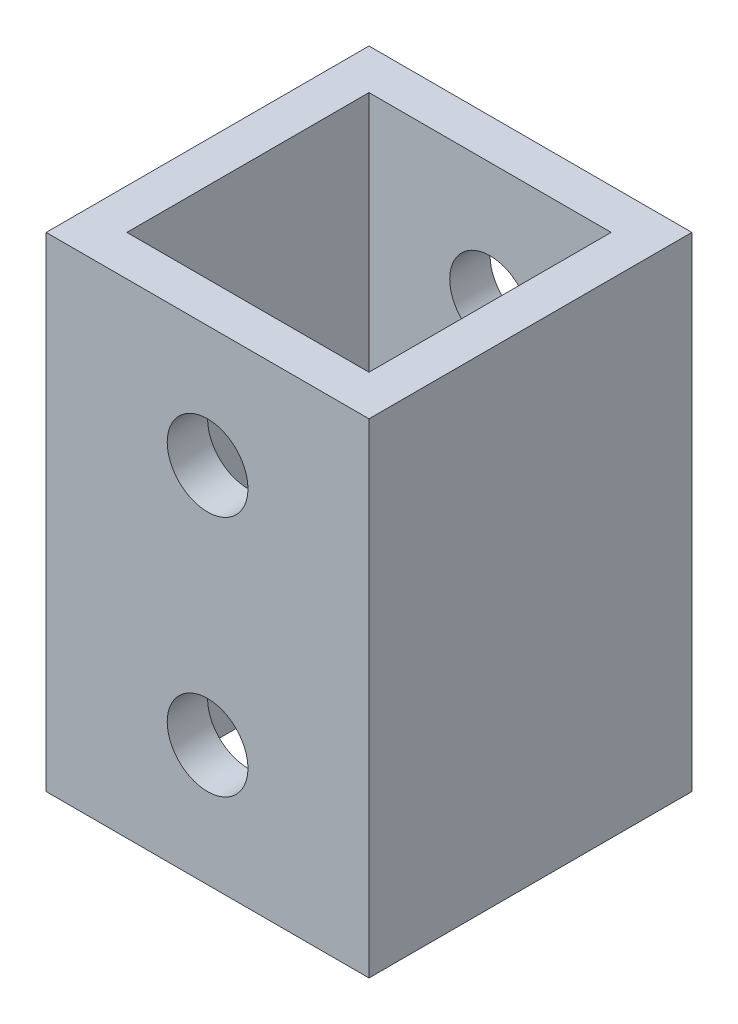
ISO-10303-21;
HEADER;
FILE_DESCRIPTION(('STEP AP214'),'2;1');
FILE_NAME('part.step','',(''),(''),'','','');
FILE_SCHEMA(('AUTOMOTIVE_DESIGN { 1 0 10303 214 1 1 1 1 }'));
ENDSEC;
DATA;
#1=APPLICATION_CONTEXT('core data for automotive mechanical design processes');
#2=APPLICATION_PROTOCOL_DEFINITION('international standard','automotive_design',2000,#1);
#3=PRODUCT_CONTEXT('',#1,'mechanical');
#4=PRODUCT('Part','Part','',(#3));
#5=PRODUCT_RELATED_PRODUCT_CATEGORY('part','',(#4));
#6=PRODUCT_DEFINITION_FORMATION('','',#4);
#7=PRODUCT_DEFINITION_CONTEXT('part definition',#1,'design');
#8=PRODUCT_DEFINITION('design','',#6,#7);
#9=PRODUCT_DEFINITION_SHAPE('','',#8);
#10=(LENGTH_UNIT() NAMED_UNIT(*) SI_UNIT(.MILLI.,.METRE.));
#11=(NAMED_UNIT(*) PLANE_ANGLE_UNIT() SI_UNIT($,.RADIAN.));
#12=(NAMED_UNIT(*) SI_UNIT($,.STERADIAN.) SOLID_ANGLE_UNIT());
#13=UNCERTAINTY_MEASURE_WITH_UNIT(LENGTH_MEASURE(1.E-05),#10,'distance_accuracy_value','');
#14=(GEOMETRIC_REPRESENTATION_CONTEXT(3) GLOBAL_UNCERTAINTY_ASSIGNED_CONTEXT((#13)) GLOBAL_UNIT_ASSIGNED_CONTEXT((#10,
#11,#12)) REPRESENTATION_CONTEXT('',''));
#15=CARTESIAN_POINT('',(0.,0.,0.));
#16=DIRECTION('',(0.,0.,1.));
#17=DIRECTION('',(1.,0.,0.));
#18=AXIS2_PLACEMENT_3D('',#15,#16,#17);
#19=CARTESIAN_POINT('',(0.,38.1,0.));
#20=DIRECTION('',(0.,1.,0.));
#21=DIRECTION('',(0.,0.,1.));
#22=AXIS2_PLACEMENT_3D('',#19,#20,#21);
#23=PLANE('',#22);
#24=DIRECTION('',(0.,0.,-1.));
#25=VECTOR('',#24,1.);
#26=CARTESIAN_POINT('',(12.7,38.1,-12.7));
#27=LINE('',#26,#25);
#28=CARTESIAN_POINT('',(12.7,38.1,12.7));
#29=VERTEX_POINT('',#28);
#30=CARTESIAN_POINT('',(12.7,38.1,-12.7));
#31=VERTEX_POINT('',#30);
#32=EDGE_CURVE('E138',#29,#31,#27,.T.);
#33=ORIENTED_EDGE('',*,*,#32,.T.);
#34=DIRECTION('',(-1.,0.,0.));
#35=VECTOR('',#34,1.);
#36=CARTESIAN_POINT('',(-12.7,38.1,-12.7));
#37=LINE('',#36,#35);
#38=CARTESIAN_POINT('',(-12.7,38.1,-12.7));
#39=VERTEX_POINT('',#38);
#40=EDGE_CURVE('E141',#31,#39,#37,.T.);
#41=ORIENTED_EDGE('',*,*,#40,.T.);
#42=DIRECTION('',(0.,0.,1.));
#43=VECTOR('',#42,1.);
#44=CARTESIAN_POINT('',(-12.7,38.1,-12.7));
#45=LINE('',#44,#43);
#46=CARTESIAN_POINT('',(-12.7,38.1,12.7));
#47=VERTEX_POINT('',#46);
#48=EDGE_CURVE('E144',#39,#47,#45,.T.);
#49=ORIENTED_EDGE('',*,*,#48,.T.);
#50=DIRECTION('',(1.,0.,0.));
#51=VECTOR('',#50,1.);
#52=CARTESIAN_POINT('',(-12.7,38.1,12.7));
#53=LINE('',#52,#51);
#54=EDGE_CURVE('E146',#47,#29,#53,.T.);
#55=ORIENTED_EDGE('',*,*,#54,.T.);
#56=EDGE_LOOP('',(#33,#41,#49,#55));
#57=FACE_BOUND('',#56,.T.);
#58=DIRECTION('',(-1.,0.,0.));
#59=VECTOR('',#58,1.);
#60=CARTESIAN_POINT('',(-9.525,38.1,-9.525));
#61=LINE('',#60,#59);
#62=CARTESIAN_POINT('',(9.525,38.1,-9.525));
#63=VERTEX_POINT('',#62);
#64=CARTESIAN_POINT('',(-9.525,38.1,-9.525));
#65=VERTEX_POINT('',#64);
#66=EDGE_CURVE('E108',#63,#65,#61,.T.);
#67=ORIENTED_EDGE('',*,*,#66,.F.);
#68=DIRECTION('',(0.,0.,-1.));
#69=VECTOR('',#68,1.);
#70=CARTESIAN_POINT('',(9.525,38.1,-9.525));
#71=LINE('',#70,#69);
#72=CARTESIAN_POINT('',(9.525,38.1,9.525));
#73=VERTEX_POINT('',#72);
#74=EDGE_CURVE('E100',#73,#63,#71,.T.);
#75=ORIENTED_EDGE('',*,*,#74,.F.);
#76=DIRECTION('',(1.,0.,0.));
#77=VECTOR('',#76,1.);
#78=CARTESIAN_POINT('',(-9.525,38.1,9.525));
#79=LINE('',#78,#77);
#80=CARTESIAN_POINT('',(-9.525,38.1,9.525));
#81=VERTEX_POINT('',#80);
#82=EDGE_CURVE('E122',#81,#73,#79,.T.);
#83=ORIENTED_EDGE('',*,*,#82,.F.);
#84=DIRECTION('',(0.,0.,1.));
#85=VECTOR('',#84,1.);
#86=CARTESIAN_POINT('',(-9.525,38.1,-9.525));
#87=LINE('',#86,#85);
#88=EDGE_CURVE('E120',#65,#81,#87,.T.);
#89=ORIENTED_EDGE('',*,*,#88,.F.);
#90=EDGE_LOOP('',(#67,#75,#83,#89));
#91=FACE_BOUND('',#90,.T.);
#92=ADVANCED_FACE('F33',(#57,#91),#23,.T.);
#93=CARTESIAN_POINT('',(0.,0.,0.));
#94=DIRECTION('',(0.,1.,0.));
#95=DIRECTION('',(0.,0.,1.));
#96=AXIS2_PLACEMENT_3D('',#93,#94,#95);
#97=PLANE('',#96);
#98=DIRECTION('',(0.,0.,-1.));
#99=VECTOR('',#98,1.);
#100=CARTESIAN_POINT('',(12.7,0.,-12.7));
#101=LINE('',#100,#99);
#102=CARTESIAN_POINT('',(12.7,0.,12.7));
#103=VERTEX_POINT('',#102);
#104=CARTESIAN_POINT('',(12.7,0.,-12.7));
#105=VERTEX_POINT('',#104);
#106=EDGE_CURVE('E116',#103,#105,#101,.T.);
#107=ORIENTED_EDGE('',*,*,#106,.F.);
#108=DIRECTION('',(1.,0.,0.));
#109=VECTOR('',#108,1.);
#110=CARTESIAN_POINT('',(-12.7,0.,12.7));
#111=LINE('',#110,#109);
#112=CARTESIAN_POINT('',(-12.7,0.,12.7));
#113=VERTEX_POINT('',#112);
#114=EDGE_CURVE('E142',#113,#103,#111,.T.);
#115=ORIENTED_EDGE('',*,*,#114,.F.);
#116=DIRECTION('',(0.,0.,1.));
#117=VECTOR('',#116,1.);
#118=CARTESIAN_POINT('',(-12.7,0.,-12.7));
#119=LINE('',#118,#117);
#120=CARTESIAN_POINT('',(-12.7,0.,-12.7));
#121=VERTEX_POINT('',#120);
#122=EDGE_CURVE('E153',#121,#113,#119,.T.);
#123=ORIENTED_EDGE('',*,*,#122,.F.);
#124=DIRECTION('',(-1.,0.,0.));
#125=VECTOR('',#124,1.);
#126=CARTESIAN_POINT('',(-12.7,0.,-12.7));
#127=LINE('',#126,#125);
#128=EDGE_CURVE('E151',#105,#121,#127,.T.);
#129=ORIENTED_EDGE('',*,*,#128,.F.);
#130=EDGE_LOOP('',(#107,#115,#123,#129));
#131=FACE_BOUND('',#130,.T.);
#132=DIRECTION('',(0.,0.,-1.));
#133=VECTOR('',#132,1.);
#134=CARTESIAN_POINT('',(9.525,0.,-9.525));
#135=LINE('',#134,#133);
#136=CARTESIAN_POINT('',(9.525,0.,9.525));
#137=VERTEX_POINT('',#136);
#138=CARTESIAN_POINT('',(9.525,0.,-9.525));
#139=VERTEX_POINT('',#138);
#140=EDGE_CURVE('E58',#137,#139,#135,.T.);
#141=ORIENTED_EDGE('',*,*,#140,.T.);
#142=DIRECTION('',(-1.,0.,0.));
#143=VECTOR('',#142,1.);
#144=CARTESIAN_POINT('',(-9.525,0.,-9.525));
#145=LINE('',#144,#143);
#146=CARTESIAN_POINT('',(-9.525,0.,-9.525));
#147=VERTEX_POINT('',#146);
#148=EDGE_CURVE('E115',#139,#147,#145,.T.);
#149=ORIENTED_EDGE('',*,*,#148,.T.);
#150=DIRECTION('',(0.,0.,1.));
#151=VECTOR('',#150,1.);
#152=CARTESIAN_POINT('',(-9.525,0.,-9.525));
#153=LINE('',#152,#151);
#154=CARTESIAN_POINT('',(-9.525,0.,9.525));
#155=VERTEX_POINT('',#154);
#156=EDGE_CURVE('E130',#147,#155,#153,.T.);
#157=ORIENTED_EDGE('',*,*,#156,.T.);
#158=DIRECTION('',(1.,0.,0.));
#159=VECTOR('',#158,1.);
#160=CARTESIAN_POINT('',(-9.525,0.,9.525));
#161=LINE('',#160,#159);
#162=EDGE_CURVE('E109',#155,#137,#161,.T.);
#163=ORIENTED_EDGE('',*,*,#162,.T.);
#164=EDGE_LOOP('',(#141,#149,#157,#163));
#165=FACE_BOUND('',#164,.T.);
#166=ADVANCED_FACE('F200',(#131,#165),#97,.F.);
#167=CARTESIAN_POINT('',(12.7,38.1,-12.7));
#168=DIRECTION('',(-1.,0.,0.));
#169=DIRECTION('',(0.,0.,1.));
#170=AXIS2_PLACEMENT_3D('',#167,#168,#169);
#171=PLANE('',#170);
#172=ORIENTED_EDGE('',*,*,#106,.T.);
#173=DIRECTION('',(0.,-1.,0.));
#174=VECTOR('',#173,1.);
#175=CARTESIAN_POINT('',(12.7,38.1,-12.7));
#176=LINE('',#175,#174);
#177=EDGE_CURVE('E11',#31,#105,#176,.T.);
#178=ORIENTED_EDGE('',*,*,#177,.F.);
#179=ORIENTED_EDGE('',*,*,#32,.F.);
#180=DIRECTION('',(0.,-1.,0.));
#181=VECTOR('',#180,1.);
#182=CARTESIAN_POINT('',(12.7,38.1,12.7));
#183=LINE('',#182,#181);
#184=EDGE_CURVE('E148',#29,#103,#183,.T.);
#185=ORIENTED_EDGE('',*,*,#184,.T.);
#186=EDGE_LOOP('',(#172,#178,#179,#185));
#187=FACE_BOUND('',#186,.T.);
#188=ADVANCED_FACE('F35',(#187),#171,.F.);
#189=CARTESIAN_POINT('',(-12.7,38.1,-12.7));
#190=DIRECTION('',(0.,0.,1.));
#191=DIRECTION('',(1.,0.,0.));
#192=AXIS2_PLACEMENT_3D('',#189,#190,#191);
#193=PLANE('',#192);
#194=CARTESIAN_POINT('',(0.,9.525,-12.7));
#195=DIRECTION('',(0.,0.,-1.));
#196=DIRECTION('',(-1.,0.,0.));
#197=AXIS2_PLACEMENT_3D('',#194,#195,#196);
#198=CIRCLE('',#197,3.175);
#199=CARTESIAN_POINT('',(-3.175,9.525,-12.7));
#200=VERTEX_POINT('',#199);
#201=EDGE_CURVE('E179',#200,#200,#198,.T.);
#202=ORIENTED_EDGE('',*,*,#201,.F.);
#203=EDGE_LOOP('',(#202));
#204=FACE_BOUND('',#203,.T.);
#205=CARTESIAN_POINT('',(0.,28.575,-12.7));
#206=DIRECTION('',(0.,0.,-1.));
#207=DIRECTION('',(-1.,0.,0.));
#208=AXIS2_PLACEMENT_3D('',#205,#206,#207);
#209=CIRCLE('',#208,3.175);
#210=CARTESIAN_POINT('',(-3.175,28.575,-12.7));
#211=VERTEX_POINT('',#210);
#212=EDGE_CURVE('E169',#211,#211,#209,.T.);
#213=ORIENTED_EDGE('',*,*,#212,.F.);
#214=EDGE_LOOP('',(#213));
#215=FACE_BOUND('',#214,.T.);
#216=ORIENTED_EDGE('',*,*,#128,.T.);
#217=DIRECTION('',(0.,-1.,0.));
#218=VECTOR('',#217,1.);
#219=CARTESIAN_POINT('',(-12.7,38.1,-12.7));
#220=LINE('',#219,#218);
#221=EDGE_CURVE('E42',#39,#121,#220,.T.);
#222=ORIENTED_EDGE('',*,*,#221,.F.);
#223=ORIENTED_EDGE('',*,*,#40,.F.);
#224=ORIENTED_EDGE('',*,*,#177,.T.);
#225=EDGE_LOOP('',(#216,#222,#223,#224));
#226=FACE_BOUND('',#225,.T.);
#227=ADVANCED_FACE('F224',(#204,#215,#226),#193,.F.);
#228=CARTESIAN_POINT('',(-12.7,38.1,-12.7));
#229=DIRECTION('',(1.,0.,0.));
#230=DIRECTION('',(0.,0.,-1.));
#231=AXIS2_PLACEMENT_3D('',#228,#229,#230);
#232=PLANE('',#231);
#233=ORIENTED_EDGE('',*,*,#122,.T.);
#234=DIRECTION('',(0.,-1.,0.));
#235=VECTOR('',#234,1.);
#236=CARTESIAN_POINT('',(-12.7,38.1,12.7));
#237=LINE('',#236,#235);
#238=EDGE_CURVE('E158',#47,#113,#237,.T.);
#239=ORIENTED_EDGE('',*,*,#238,.F.);
#240=ORIENTED_EDGE('',*,*,#48,.F.);
#241=ORIENTED_EDGE('',*,*,#221,.T.);
#242=EDGE_LOOP('',(#233,#239,#240,#241));
#243=FACE_BOUND('',#242,.T.);
#244=ADVANCED_FACE('F222',(#243),#232,.F.);
#245=CARTESIAN_POINT('',(-12.7,38.1,12.7));
#246=DIRECTION('',(0.,0.,-1.));
#247=DIRECTION('',(-1.,0.,0.));
#248=AXIS2_PLACEMENT_3D('',#245,#246,#247);
#249=PLANE('',#248);
#250=CARTESIAN_POINT('',(0.,9.525,12.7));
#251=DIRECTION('',(0.,0.,-1.));
#252=DIRECTION('',(-1.,0.,0.));
#253=AXIS2_PLACEMENT_3D('',#250,#251,#252);
#254=CIRCLE('',#253,3.175);
#255=CARTESIAN_POINT('',(-3.175,9.525,12.7));
#256=VERTEX_POINT('',#255);
#257=EDGE_CURVE('E182',#256,#256,#254,.T.);
#258=ORIENTED_EDGE('',*,*,#257,.T.);
#259=EDGE_LOOP('',(#258));
#260=FACE_BOUND('',#259,.T.);
#261=CARTESIAN_POINT('',(0.,28.575,12.7));
#262=DIRECTION('',(0.,0.,-1.));
#263=DIRECTION('',(-1.,0.,0.));
#264=AXIS2_PLACEMENT_3D('',#261,#262,#263);
#265=CIRCLE('',#264,3.175);
#266=CARTESIAN_POINT('',(-3.175,28.575,12.7));
#267=VERTEX_POINT('',#266);
#268=EDGE_CURVE('E164',#267,#267,#265,.T.);
#269=ORIENTED_EDGE('',*,*,#268,.T.);
#270=EDGE_LOOP('',(#269));
#271=FACE_BOUND('',#270,.T.);
#272=ORIENTED_EDGE('',*,*,#114,.T.);
#273=ORIENTED_EDGE('',*,*,#184,.F.);
#274=ORIENTED_EDGE('',*,*,#54,.F.);
#275=ORIENTED_EDGE('',*,*,#238,.T.);
#276=EDGE_LOOP('',(#272,#273,#274,#275));
#277=FACE_BOUND('',#276,.T.);
#278=ADVANCED_FACE('F219',(#260,#271,#277),#249,.F.);
#279=CARTESIAN_POINT('',(9.525,38.1,-9.525));
#280=DIRECTION('',(-1.,0.,0.));
#281=DIRECTION('',(0.,0.,1.));
#282=AXIS2_PLACEMENT_3D('',#279,#280,#281);
#283=PLANE('',#282);
#284=ORIENTED_EDGE('',*,*,#140,.F.);
#285=DIRECTION('',(0.,-1.,0.));
#286=VECTOR('',#285,1.);
#287=CARTESIAN_POINT('',(9.525,38.1,9.525));
#288=LINE('',#287,#286);
#289=EDGE_CURVE('E104',#73,#137,#288,.T.);
#290=ORIENTED_EDGE('',*,*,#289,.F.);
#291=ORIENTED_EDGE('',*,*,#74,.T.);
#292=DIRECTION('',(0.,-1.,0.));
#293=VECTOR('',#292,1.);
#294=CARTESIAN_POINT('',(9.525,38.1,-9.525));
#295=LINE('',#294,#293);
#296=EDGE_CURVE('E103',#63,#139,#295,.T.);
#297=ORIENTED_EDGE('',*,*,#296,.T.);
#298=EDGE_LOOP('',(#284,#290,#291,#297));
#299=FACE_BOUND('',#298,.T.);
#300=ADVANCED_FACE('F102',(#299),#283,.T.);
#301=CARTESIAN_POINT('',(-9.525,38.1,-9.525));
#302=DIRECTION('',(0.,0.,1.));
#303=DIRECTION('',(1.,0.,0.));
#304=AXIS2_PLACEMENT_3D('',#301,#302,#303);
#305=PLANE('',#304);
#306=CARTESIAN_POINT('',(0.,9.525,-9.525));
#307=DIRECTION('',(0.,0.,1.));
#308=DIRECTION('',(1.,0.,0.));
#309=AXIS2_PLACEMENT_3D('',#306,#307,#308);
#310=CIRCLE('',#309,3.175);
#311=CARTESIAN_POINT('',(3.175,9.525,-9.525));
#312=VERTEX_POINT('',#311);
#313=EDGE_CURVE('E174',#312,#312,#310,.T.);
#314=ORIENTED_EDGE('',*,*,#313,.F.);
#315=EDGE_LOOP('',(#314));
#316=FACE_BOUND('',#315,.T.);
#317=CARTESIAN_POINT('',(0.,28.575,-9.525));
#318=DIRECTION('',(0.,0.,1.));
#319=DIRECTION('',(1.,0.,0.));
#320=AXIS2_PLACEMENT_3D('',#317,#318,#319);
#321=CIRCLE('',#320,3.175);
#322=CARTESIAN_POINT('',(3.175,28.575,-9.525));
#323=VERTEX_POINT('',#322);
#324=EDGE_CURVE('E128',#323,#323,#321,.T.);
#325=ORIENTED_EDGE('',*,*,#324,.F.);
#326=EDGE_LOOP('',(#325));
#327=FACE_BOUND('',#326,.T.);
#328=ORIENTED_EDGE('',*,*,#148,.F.);
#329=ORIENTED_EDGE('',*,*,#296,.F.);
#330=ORIENTED_EDGE('',*,*,#66,.T.);
#331=DIRECTION('',(0.,-1.,0.));
#332=VECTOR('',#331,1.);
#333=CARTESIAN_POINT('',(-9.525,38.1,-9.525));
#334=LINE('',#333,#332);
#335=EDGE_CURVE('E117',#65,#147,#334,.T.);
#336=ORIENTED_EDGE('',*,*,#335,.T.);
#337=EDGE_LOOP('',(#328,#329,#330,#336));
#338=FACE_BOUND('',#337,.T.);
#339=ADVANCED_FACE('F112',(#316,#327,#338),#305,.T.);
#340=CARTESIAN_POINT('',(-9.525,38.1,-9.525));
#341=DIRECTION('',(1.,0.,0.));
#342=DIRECTION('',(0.,0.,-1.));
#343=AXIS2_PLACEMENT_3D('',#340,#341,#342);
#344=PLANE('',#343);
#345=ORIENTED_EDGE('',*,*,#156,.F.);
#346=ORIENTED_EDGE('',*,*,#335,.F.);
#347=ORIENTED_EDGE('',*,*,#88,.T.);
#348=DIRECTION('',(0.,-1.,0.));
#349=VECTOR('',#348,1.);
#350=CARTESIAN_POINT('',(-9.525,38.1,9.525));
#351=LINE('',#350,#349);
#352=EDGE_CURVE('E50',#81,#155,#351,.T.);
#353=ORIENTED_EDGE('',*,*,#352,.T.);
#354=EDGE_LOOP('',(#345,#346,#347,#353));
#355=FACE_BOUND('',#354,.T.);
#356=ADVANCED_FACE('F196',(#355),#344,.T.);
#357=CARTESIAN_POINT('',(-9.525,38.1,9.525));
#358=DIRECTION('',(0.,0.,-1.));
#359=DIRECTION('',(-1.,0.,0.));
#360=AXIS2_PLACEMENT_3D('',#357,#358,#359);
#361=PLANE('',#360);
#362=CARTESIAN_POINT('',(0.,9.525,9.525));
#363=DIRECTION('',(0.,0.,-1.));
#364=DIRECTION('',(-1.,0.,0.));
#365=AXIS2_PLACEMENT_3D('',#362,#363,#364);
#366=CIRCLE('',#365,3.175);
#367=CARTESIAN_POINT('',(-3.175,9.525,9.525));
#368=VERTEX_POINT('',#367);
#369=EDGE_CURVE('E37',#368,#368,#366,.T.);
#370=ORIENTED_EDGE('',*,*,#369,.F.);
#371=EDGE_LOOP('',(#370));
#372=FACE_BOUND('',#371,.T.);
#373=CARTESIAN_POINT('',(0.,28.575,9.525));
#374=DIRECTION('',(0.,0.,-1.));
#375=DIRECTION('',(-1.,0.,0.));
#376=AXIS2_PLACEMENT_3D('',#373,#374,#375);
#377=CIRCLE('',#376,3.175);
#378=CARTESIAN_POINT('',(-3.175,28.575,9.525));
#379=VERTEX_POINT('',#378);
#380=EDGE_CURVE('E162',#379,#379,#377,.T.);
#381=ORIENTED_EDGE('',*,*,#380,.F.);
#382=EDGE_LOOP('',(#381));
#383=FACE_BOUND('',#382,.T.);
#384=ORIENTED_EDGE('',*,*,#162,.F.);
#385=ORIENTED_EDGE('',*,*,#352,.F.);
#386=ORIENTED_EDGE('',*,*,#82,.T.);
#387=ORIENTED_EDGE('',*,*,#289,.T.);
#388=EDGE_LOOP('',(#384,#385,#386,#387));
#389=FACE_BOUND('',#388,.T.);
#390=ADVANCED_FACE('F192',(#372,#383,#389),#361,.T.);
#391=CARTESIAN_POINT('',(0.,28.575,12.7));
#392=DIRECTION('',(0.,0.,-1.));
#393=DIRECTION('',(-1.,0.,0.));
#394=AXIS2_PLACEMENT_3D('',#391,#392,#393);
#395=CYLINDRICAL_SURFACE('',#394,3.175);
#396=ORIENTED_EDGE('',*,*,#380,.T.);
#397=EDGE_LOOP('',(#396));
#398=FACE_BOUND('',#397,.T.);
#399=ORIENTED_EDGE('',*,*,#268,.F.);
#400=EDGE_LOOP('',(#399));
#401=FACE_BOUND('',#400,.T.);
#402=ADVANCED_FACE('F195',(#398,#401),#395,.F.);
#403=ORIENTED_EDGE('',*,*,#324,.T.);
#404=EDGE_LOOP('',(#403));
#405=FACE_BOUND('',#404,.T.);
#406=ORIENTED_EDGE('',*,*,#212,.T.);
#407=EDGE_LOOP('',(#406));
#408=FACE_BOUND('',#407,.T.);
#409=ADVANCED_FACE('F248',(#405,#408),#395,.F.);
#410=CARTESIAN_POINT('',(0.,9.525,12.7));
#411=DIRECTION('',(0.,0.,-1.));
#412=DIRECTION('',(-1.,0.,0.));
#413=AXIS2_PLACEMENT_3D('',#410,#411,#412);
#414=CYLINDRICAL_SURFACE('',#413,3.175);
#415=ORIENTED_EDGE('',*,*,#369,.T.);
#416=EDGE_LOOP('',(#415));
#417=FACE_BOUND('',#416,.T.);
#418=ORIENTED_EDGE('',*,*,#257,.F.);
#419=EDGE_LOOP('',(#418));
#420=FACE_BOUND('',#419,.T.);
#421=ADVANCED_FACE('F189',(#417,#420),#414,.F.);
#422=ORIENTED_EDGE('',*,*,#313,.T.);
#423=EDGE_LOOP('',(#422));
#424=FACE_BOUND('',#423,.T.);
#425=ORIENTED_EDGE('',*,*,#201,.T.);
#426=EDGE_LOOP('',(#425));
#427=FACE_BOUND('',#426,.T.);
#428=ADVANCED_FACE('F256',(#424,#427),#414,.F.);
#429=CLOSED_SHELL('',(#92,#166,#188,#227,#244,#278,#300,#339,#356,#390,#402,#409,#421,#428));
#430=MANIFOLD_SOLID_BREP('B2',#429);
#431=ADVANCED_BREP_SHAPE_REPRESENTATION('',(#18,#430),#14);
#432=SHAPE_DEFINITION_REPRESENTATION(#9,#431);
ENDSEC;
END-ISO-10303-21;
